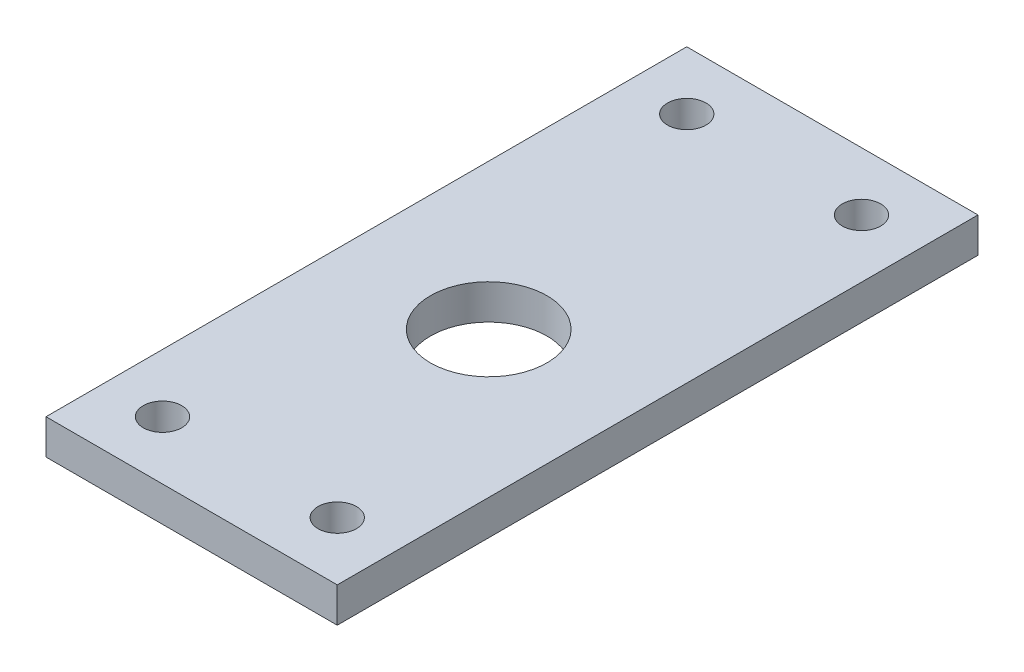
ISO-10303-21;
HEADER;
FILE_DESCRIPTION(('STEP AP214'),'2;1');
FILE_NAME('part.step','',(''),(''),'','','');
FILE_SCHEMA(('AUTOMOTIVE_DESIGN { 1 0 10303 214 1 1 1 1 }'));
ENDSEC;
DATA;
#1=APPLICATION_CONTEXT('core data for automotive mechanical design processes');
#2=APPLICATION_PROTOCOL_DEFINITION('international standard','automotive_design',2000,#1);
#3=PRODUCT_CONTEXT('',#1,'mechanical');
#4=PRODUCT('Part','Part','',(#3));
#5=PRODUCT_RELATED_PRODUCT_CATEGORY('part','',(#4));
#6=PRODUCT_DEFINITION_FORMATION('','',#4);
#7=PRODUCT_DEFINITION_CONTEXT('part definition',#1,'design');
#8=PRODUCT_DEFINITION('design','',#6,#7);
#9=PRODUCT_DEFINITION_SHAPE('','',#8);
#10=(LENGTH_UNIT() NAMED_UNIT(*) SI_UNIT(.MILLI.,.METRE.));
#11=(NAMED_UNIT(*) PLANE_ANGLE_UNIT() SI_UNIT($,.RADIAN.));
#12=(NAMED_UNIT(*) SI_UNIT($,.STERADIAN.) SOLID_ANGLE_UNIT());
#13=UNCERTAINTY_MEASURE_WITH_UNIT(LENGTH_MEASURE(1.E-05),#10,'distance_accuracy_value','');
#14=(GEOMETRIC_REPRESENTATION_CONTEXT(3) GLOBAL_UNCERTAINTY_ASSIGNED_CONTEXT((#13)) GLOBAL_UNIT_ASSIGNED_CONTEXT((#10,
#11,#12)) REPRESENTATION_CONTEXT('',''));
#15=CARTESIAN_POINT('',(0.,0.,0.));
#16=DIRECTION('',(0.,0.,1.));
#17=DIRECTION('',(1.,0.,0.));
#18=AXIS2_PLACEMENT_3D('',#15,#16,#17);
#19=CARTESIAN_POINT('',(12.5,3.,-27.5));
#20=DIRECTION('',(-1.,0.,0.));
#21=DIRECTION('',(0.,0.,1.));
#22=AXIS2_PLACEMENT_3D('',#19,#20,#21);
#23=PLANE('',#22);
#24=DIRECTION('',(0.,0.,-1.));
#25=VECTOR('',#24,1.);
#26=CARTESIAN_POINT('',(12.5,0.,-27.5));
#27=LINE('',#26,#25);
#28=CARTESIAN_POINT('',(12.5,0.,27.5));
#29=VERTEX_POINT('',#28);
#30=CARTESIAN_POINT('',(12.5,0.,-27.5));
#31=VERTEX_POINT('',#30);
#32=EDGE_CURVE('E102',#29,#31,#27,.T.);
#33=ORIENTED_EDGE('',*,*,#32,.T.);
#34=DIRECTION('',(0.,-1.,0.));
#35=VECTOR('',#34,1.);
#36=CARTESIAN_POINT('',(12.5,3.,-27.5));
#37=LINE('',#36,#35);
#38=CARTESIAN_POINT('',(12.5,3.,-27.5));
#39=VERTEX_POINT('',#38);
#40=EDGE_CURVE('E11',#39,#31,#37,.T.);
#41=ORIENTED_EDGE('',*,*,#40,.F.);
#42=DIRECTION('',(0.,0.,-1.));
#43=VECTOR('',#42,1.);
#44=CARTESIAN_POINT('',(12.5,3.,-27.5));
#45=LINE('',#44,#43);
#46=CARTESIAN_POINT('',(12.5,3.,27.5));
#47=VERTEX_POINT('',#46);
#48=EDGE_CURVE('E90',#47,#39,#45,.T.);
#49=ORIENTED_EDGE('',*,*,#48,.F.);
#50=DIRECTION('',(0.,-1.,0.));
#51=VECTOR('',#50,1.);
#52=CARTESIAN_POINT('',(12.5,3.,27.5));
#53=LINE('',#52,#51);
#54=EDGE_CURVE('E98',#47,#29,#53,.T.);
#55=ORIENTED_EDGE('',*,*,#54,.T.);
#56=EDGE_LOOP('',(#33,#41,#49,#55));
#57=FACE_BOUND('',#56,.T.);
#58=ADVANCED_FACE('F39',(#57),#23,.F.);
#59=CARTESIAN_POINT('',(-12.5,3.,-27.5));
#60=DIRECTION('',(0.,0.,1.));
#61=DIRECTION('',(1.,0.,0.));
#62=AXIS2_PLACEMENT_3D('',#59,#60,#61);
#63=PLANE('',#62);
#64=DIRECTION('',(-1.,0.,0.));
#65=VECTOR('',#64,1.);
#66=CARTESIAN_POINT('',(-12.5,0.,-27.5));
#67=LINE('',#66,#65);
#68=CARTESIAN_POINT('',(-12.5,0.,-27.5));
#69=VERTEX_POINT('',#68);
#70=EDGE_CURVE('E94',#31,#69,#67,.T.);
#71=ORIENTED_EDGE('',*,*,#70,.T.);
#72=DIRECTION('',(0.,-1.,0.));
#73=VECTOR('',#72,1.);
#74=CARTESIAN_POINT('',(-12.5,3.,-27.5));
#75=LINE('',#74,#73);
#76=CARTESIAN_POINT('',(-12.5,3.,-27.5));
#77=VERTEX_POINT('',#76);
#78=EDGE_CURVE('E47',#77,#69,#75,.T.);
#79=ORIENTED_EDGE('',*,*,#78,.F.);
#80=DIRECTION('',(-1.,0.,0.));
#81=VECTOR('',#80,1.);
#82=CARTESIAN_POINT('',(-12.5,3.,-27.5));
#83=LINE('',#82,#81);
#84=EDGE_CURVE('E85',#39,#77,#83,.T.);
#85=ORIENTED_EDGE('',*,*,#84,.F.);
#86=ORIENTED_EDGE('',*,*,#40,.T.);
#87=EDGE_LOOP('',(#71,#79,#85,#86));
#88=FACE_BOUND('',#87,.T.);
#89=ADVANCED_FACE('F93',(#88),#63,.F.);
#90=CARTESIAN_POINT('',(-12.5,3.,-27.5));
#91=DIRECTION('',(1.,0.,0.));
#92=DIRECTION('',(0.,0.,-1.));
#93=AXIS2_PLACEMENT_3D('',#90,#91,#92);
#94=PLANE('',#93);
#95=DIRECTION('',(0.,0.,1.));
#96=VECTOR('',#95,1.);
#97=CARTESIAN_POINT('',(-12.5,0.,-27.5));
#98=LINE('',#97,#96);
#99=CARTESIAN_POINT('',(-12.5,0.,27.5));
#100=VERTEX_POINT('',#99);
#101=EDGE_CURVE('E72',#69,#100,#98,.T.);
#102=ORIENTED_EDGE('',*,*,#101,.T.);
#103=DIRECTION('',(0.,-1.,0.));
#104=VECTOR('',#103,1.);
#105=CARTESIAN_POINT('',(-12.5,3.,27.5));
#106=LINE('',#105,#104);
#107=CARTESIAN_POINT('',(-12.5,3.,27.5));
#108=VERTEX_POINT('',#107);
#109=EDGE_CURVE('E95',#108,#100,#106,.T.);
#110=ORIENTED_EDGE('',*,*,#109,.F.);
#111=DIRECTION('',(0.,0.,1.));
#112=VECTOR('',#111,1.);
#113=CARTESIAN_POINT('',(-12.5,3.,-27.5));
#114=LINE('',#113,#112);
#115=EDGE_CURVE('E88',#77,#108,#114,.T.);
#116=ORIENTED_EDGE('',*,*,#115,.F.);
#117=ORIENTED_EDGE('',*,*,#78,.T.);
#118=EDGE_LOOP('',(#102,#110,#116,#117));
#119=FACE_BOUND('',#118,.T.);
#120=ADVANCED_FACE('F96',(#119),#94,.F.);
#121=CARTESIAN_POINT('',(-12.5,3.,27.5));
#122=DIRECTION('',(0.,0.,-1.));
#123=DIRECTION('',(-1.,0.,0.));
#124=AXIS2_PLACEMENT_3D('',#121,#122,#123);
#125=PLANE('',#124);
#126=DIRECTION('',(1.,0.,0.));
#127=VECTOR('',#126,1.);
#128=CARTESIAN_POINT('',(-12.5,0.,27.5));
#129=LINE('',#128,#127);
#130=EDGE_CURVE('E78',#100,#29,#129,.T.);
#131=ORIENTED_EDGE('',*,*,#130,.T.);
#132=ORIENTED_EDGE('',*,*,#54,.F.);
#133=DIRECTION('',(1.,0.,0.));
#134=VECTOR('',#133,1.);
#135=CARTESIAN_POINT('',(-12.5,3.,27.5));
#136=LINE('',#135,#134);
#137=EDGE_CURVE('E55',#108,#47,#136,.T.);
#138=ORIENTED_EDGE('',*,*,#137,.F.);
#139=ORIENTED_EDGE('',*,*,#109,.T.);
#140=EDGE_LOOP('',(#131,#132,#138,#139));
#141=FACE_BOUND('',#140,.T.);
#142=ADVANCED_FACE('F110',(#141),#125,.F.);
#143=CARTESIAN_POINT('',(0.,3.,0.));
#144=DIRECTION('',(0.,1.,0.));
#145=DIRECTION('',(0.,0.,1.));
#146=AXIS2_PLACEMENT_3D('',#143,#144,#145);
#147=PLANE('',#146);
#148=CARTESIAN_POINT('',(0.,3.,2.));
#149=DIRECTION('',(0.,1.,0.));
#150=DIRECTION('',(0.,0.,1.));
#151=AXIS2_PLACEMENT_3D('',#148,#149,#150);
#152=CIRCLE('',#151,5.00000000000001);
#153=CARTESIAN_POINT('',(0.,3.,7.00000000000001));
#154=VERTEX_POINT('',#153);
#155=EDGE_CURVE('E142',#154,#154,#152,.T.);
#156=ORIENTED_EDGE('',*,*,#155,.F.);
#157=EDGE_LOOP('',(#156));
#158=FACE_BOUND('',#157,.T.);
#159=CARTESIAN_POINT('',(-7.5,3.,-22.5));
#160=DIRECTION('',(0.,1.,0.));
#161=DIRECTION('',(0.,0.,1.));
#162=AXIS2_PLACEMENT_3D('',#159,#160,#161);
#163=CIRCLE('',#162,1.65000000000001);
#164=CARTESIAN_POINT('',(-7.5,3.,-20.85));
#165=VERTEX_POINT('',#164);
#166=EDGE_CURVE('E136',#165,#165,#163,.T.);
#167=ORIENTED_EDGE('',*,*,#166,.F.);
#168=EDGE_LOOP('',(#167));
#169=FACE_BOUND('',#168,.T.);
#170=CARTESIAN_POINT('',(7.5,3.,-22.5));
#171=DIRECTION('',(0.,1.,0.));
#172=DIRECTION('',(0.,0.,1.));
#173=AXIS2_PLACEMENT_3D('',#170,#171,#172);
#174=CIRCLE('',#173,1.65000000000001);
#175=CARTESIAN_POINT('',(7.5,3.,-20.85));
#176=VERTEX_POINT('',#175);
#177=EDGE_CURVE('E130',#176,#176,#174,.T.);
#178=ORIENTED_EDGE('',*,*,#177,.F.);
#179=EDGE_LOOP('',(#178));
#180=FACE_BOUND('',#179,.T.);
#181=CARTESIAN_POINT('',(7.50000000000001,3.,22.5));
#182=DIRECTION('',(0.,1.,0.));
#183=DIRECTION('',(0.,0.,1.));
#184=AXIS2_PLACEMENT_3D('',#181,#182,#183);
#185=CIRCLE('',#184,1.65000000000001);
#186=CARTESIAN_POINT('',(7.50000000000001,3.,24.15));
#187=VERTEX_POINT('',#186);
#188=EDGE_CURVE('E124',#187,#187,#185,.T.);
#189=ORIENTED_EDGE('',*,*,#188,.F.);
#190=EDGE_LOOP('',(#189));
#191=FACE_BOUND('',#190,.T.);
#192=CARTESIAN_POINT('',(-7.49999999999999,3.,22.5));
#193=DIRECTION('',(0.,1.,0.));
#194=DIRECTION('',(0.,0.,1.));
#195=AXIS2_PLACEMENT_3D('',#192,#193,#194);
#196=CIRCLE('',#195,1.65000000000001);
#197=CARTESIAN_POINT('',(-7.49999999999999,3.,24.15));
#198=VERTEX_POINT('',#197);
#199=EDGE_CURVE('E118',#198,#198,#196,.T.);
#200=ORIENTED_EDGE('',*,*,#199,.F.);
#201=EDGE_LOOP('',(#200));
#202=FACE_BOUND('',#201,.T.);
#203=ORIENTED_EDGE('',*,*,#48,.T.);
#204=ORIENTED_EDGE('',*,*,#84,.T.);
#205=ORIENTED_EDGE('',*,*,#115,.T.);
#206=ORIENTED_EDGE('',*,*,#137,.T.);
#207=EDGE_LOOP('',(#203,#204,#205,#206));
#208=FACE_BOUND('',#207,.T.);
#209=ADVANCED_FACE('F86',(#158,#169,#180,#191,#202,#208),#147,.T.);
#210=CARTESIAN_POINT('',(0.,0.,0.));
#211=DIRECTION('',(0.,1.,0.));
#212=DIRECTION('',(0.,0.,1.));
#213=AXIS2_PLACEMENT_3D('',#210,#211,#212);
#214=PLANE('',#213);
#215=CARTESIAN_POINT('',(0.,0.,2.));
#216=DIRECTION('',(0.,1.,0.));
#217=DIRECTION('',(0.,0.,1.));
#218=AXIS2_PLACEMENT_3D('',#215,#216,#217);
#219=CIRCLE('',#218,5.00000000000001);
#220=CARTESIAN_POINT('',(0.,0.,7.00000000000001));
#221=VERTEX_POINT('',#220);
#222=EDGE_CURVE('E139',#221,#221,#219,.T.);
#223=ORIENTED_EDGE('',*,*,#222,.T.);
#224=EDGE_LOOP('',(#223));
#225=FACE_BOUND('',#224,.T.);
#226=CARTESIAN_POINT('',(-7.5,0.,-22.5));
#227=DIRECTION('',(0.,1.,0.));
#228=DIRECTION('',(0.,0.,1.));
#229=AXIS2_PLACEMENT_3D('',#226,#227,#228);
#230=CIRCLE('',#229,1.65000000000001);
#231=CARTESIAN_POINT('',(-7.5,0.,-20.85));
#232=VERTEX_POINT('',#231);
#233=EDGE_CURVE('E133',#232,#232,#230,.T.);
#234=ORIENTED_EDGE('',*,*,#233,.T.);
#235=EDGE_LOOP('',(#234));
#236=FACE_BOUND('',#235,.T.);
#237=CARTESIAN_POINT('',(7.5,0.,-22.5));
#238=DIRECTION('',(0.,1.,0.));
#239=DIRECTION('',(0.,0.,1.));
#240=AXIS2_PLACEMENT_3D('',#237,#238,#239);
#241=CIRCLE('',#240,1.65000000000001);
#242=CARTESIAN_POINT('',(7.5,0.,-20.85));
#243=VERTEX_POINT('',#242);
#244=EDGE_CURVE('E127',#243,#243,#241,.T.);
#245=ORIENTED_EDGE('',*,*,#244,.T.);
#246=EDGE_LOOP('',(#245));
#247=FACE_BOUND('',#246,.T.);
#248=CARTESIAN_POINT('',(7.50000000000001,0.,22.5));
#249=DIRECTION('',(0.,1.,0.));
#250=DIRECTION('',(0.,0.,1.));
#251=AXIS2_PLACEMENT_3D('',#248,#249,#250);
#252=CIRCLE('',#251,1.65000000000001);
#253=CARTESIAN_POINT('',(7.50000000000001,0.,24.15));
#254=VERTEX_POINT('',#253);
#255=EDGE_CURVE('E121',#254,#254,#252,.T.);
#256=ORIENTED_EDGE('',*,*,#255,.T.);
#257=EDGE_LOOP('',(#256));
#258=FACE_BOUND('',#257,.T.);
#259=CARTESIAN_POINT('',(-7.49999999999999,0.,22.5));
#260=DIRECTION('',(0.,1.,0.));
#261=DIRECTION('',(0.,0.,1.));
#262=AXIS2_PLACEMENT_3D('',#259,#260,#261);
#263=CIRCLE('',#262,1.65000000000001);
#264=CARTESIAN_POINT('',(-7.49999999999999,0.,24.15));
#265=VERTEX_POINT('',#264);
#266=EDGE_CURVE('E105',#265,#265,#263,.T.);
#267=ORIENTED_EDGE('',*,*,#266,.T.);
#268=EDGE_LOOP('',(#267));
#269=FACE_BOUND('',#268,.T.);
#270=ORIENTED_EDGE('',*,*,#32,.F.);
#271=ORIENTED_EDGE('',*,*,#130,.F.);
#272=ORIENTED_EDGE('',*,*,#101,.F.);
#273=ORIENTED_EDGE('',*,*,#70,.F.);
#274=EDGE_LOOP('',(#270,#271,#272,#273));
#275=FACE_BOUND('',#274,.T.);
#276=ADVANCED_FACE('F113',(#225,#236,#247,#258,#269,#275),#214,.F.);
#277=CARTESIAN_POINT('',(-7.49999999999999,3.,22.5));
#278=DIRECTION('',(0.,1.,0.));
#279=DIRECTION('',(0.,0.,1.));
#280=AXIS2_PLACEMENT_3D('',#277,#278,#279);
#281=CYLINDRICAL_SURFACE('',#280,1.65000000000001);
#282=ORIENTED_EDGE('',*,*,#266,.F.);
#283=EDGE_LOOP('',(#282));
#284=FACE_BOUND('',#283,.T.);
#285=ORIENTED_EDGE('',*,*,#199,.T.);
#286=EDGE_LOOP('',(#285));
#287=FACE_BOUND('',#286,.T.);
#288=ADVANCED_FACE('F159',(#284,#287),#281,.F.);
#289=CARTESIAN_POINT('',(7.50000000000001,3.,22.5));
#290=DIRECTION('',(0.,1.,0.));
#291=DIRECTION('',(0.,0.,1.));
#292=AXIS2_PLACEMENT_3D('',#289,#290,#291);
#293=CYLINDRICAL_SURFACE('',#292,1.65000000000001);
#294=ORIENTED_EDGE('',*,*,#255,.F.);
#295=EDGE_LOOP('',(#294));
#296=FACE_BOUND('',#295,.T.);
#297=ORIENTED_EDGE('',*,*,#188,.T.);
#298=EDGE_LOOP('',(#297));
#299=FACE_BOUND('',#298,.T.);
#300=ADVANCED_FACE('F161',(#296,#299),#293,.F.);
#301=CARTESIAN_POINT('',(7.5,3.,-22.5));
#302=DIRECTION('',(0.,1.,0.));
#303=DIRECTION('',(0.,0.,1.));
#304=AXIS2_PLACEMENT_3D('',#301,#302,#303);
#305=CYLINDRICAL_SURFACE('',#304,1.65000000000001);
#306=ORIENTED_EDGE('',*,*,#244,.F.);
#307=EDGE_LOOP('',(#306));
#308=FACE_BOUND('',#307,.T.);
#309=ORIENTED_EDGE('',*,*,#177,.T.);
#310=EDGE_LOOP('',(#309));
#311=FACE_BOUND('',#310,.T.);
#312=ADVANCED_FACE('F168',(#308,#311),#305,.F.);
#313=CARTESIAN_POINT('',(-7.5,3.,-22.5));
#314=DIRECTION('',(0.,1.,0.));
#315=DIRECTION('',(0.,0.,1.));
#316=AXIS2_PLACEMENT_3D('',#313,#314,#315);
#317=CYLINDRICAL_SURFACE('',#316,1.65000000000001);
#318=ORIENTED_EDGE('',*,*,#233,.F.);
#319=EDGE_LOOP('',(#318));
#320=FACE_BOUND('',#319,.T.);
#321=ORIENTED_EDGE('',*,*,#166,.T.);
#322=EDGE_LOOP('',(#321));
#323=FACE_BOUND('',#322,.T.);
#324=ADVANCED_FACE('F228',(#320,#323),#317,.F.);
#325=CARTESIAN_POINT('',(0.,3.,2.));
#326=DIRECTION('',(0.,1.,0.));
#327=DIRECTION('',(0.,0.,1.));
#328=AXIS2_PLACEMENT_3D('',#325,#326,#327);
#329=CYLINDRICAL_SURFACE('',#328,5.00000000000001);
#330=ORIENTED_EDGE('',*,*,#222,.F.);
#331=EDGE_LOOP('',(#330));
#332=FACE_BOUND('',#331,.T.);
#333=ORIENTED_EDGE('',*,*,#155,.T.);
#334=EDGE_LOOP('',(#333));
#335=FACE_BOUND('',#334,.T.);
#336=ADVANCED_FACE('F146',(#332,#335),#329,.F.);
#337=CLOSED_SHELL('',(#58,#89,#120,#142,#209,#276,#288,#300,#312,#324,#336));
#338=MANIFOLD_SOLID_BREP('B2',#337);
#339=ADVANCED_BREP_SHAPE_REPRESENTATION('',(#18,#338),#14);
#340=SHAPE_DEFINITION_REPRESENTATION(#9,#339);
ENDSEC;
END-ISO-10303-21;
